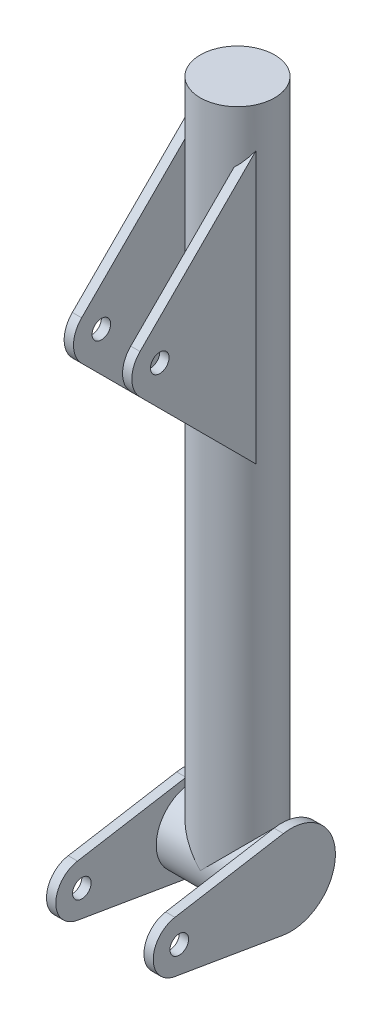
ISO-10303-21;
HEADER;
FILE_DESCRIPTION(('STEP AP214'),'2;1');
FILE_NAME('part.step','',(''),(''),'','','');
FILE_SCHEMA(('AUTOMOTIVE_DESIGN { 1 0 10303 214 1 1 1 1 }'));
ENDSEC;
DATA;
#1=APPLICATION_CONTEXT('core data for automotive mechanical design processes');
#2=APPLICATION_PROTOCOL_DEFINITION('international standard','automotive_design',2000,#1);
#3=PRODUCT_CONTEXT('',#1,'mechanical');
#4=PRODUCT('Part','Part','',(#3));
#5=PRODUCT_RELATED_PRODUCT_CATEGORY('part','',(#4));
#6=PRODUCT_DEFINITION_FORMATION('','',#4);
#7=PRODUCT_DEFINITION_CONTEXT('part definition',#1,'design');
#8=PRODUCT_DEFINITION('design','',#6,#7);
#9=PRODUCT_DEFINITION_SHAPE('','',#8);
#10=(LENGTH_UNIT() NAMED_UNIT(*) SI_UNIT(.MILLI.,.METRE.));
#11=(NAMED_UNIT(*) PLANE_ANGLE_UNIT() SI_UNIT($,.RADIAN.));
#12=(NAMED_UNIT(*) SI_UNIT($,.STERADIAN.) SOLID_ANGLE_UNIT());
#13=UNCERTAINTY_MEASURE_WITH_UNIT(LENGTH_MEASURE(1.E-05),#10,'distance_accuracy_value','');
#14=(GEOMETRIC_REPRESENTATION_CONTEXT(3) GLOBAL_UNCERTAINTY_ASSIGNED_CONTEXT((#13)) GLOBAL_UNIT_ASSIGNED_CONTEXT((#10,
#11,#12)) REPRESENTATION_CONTEXT('',''));
#15=CARTESIAN_POINT('',(0.,0.,0.));
#16=DIRECTION('',(0.,0.,1.));
#17=DIRECTION('',(1.,0.,0.));
#18=AXIS2_PLACEMENT_3D('',#15,#16,#17);
#19=CARTESIAN_POINT('',(0.,228.6,0.));
#20=DIRECTION('',(0.,-1.,0.));
#21=DIRECTION('',(0.,0.,-1.));
#22=AXIS2_PLACEMENT_3D('',#19,#20,#21);
#23=CYLINDRICAL_SURFACE('',#22,12.7);
#24=CARTESIAN_POINT('',(0.,0.,0.));
#25=DIRECTION('',(-0.707106781186547,0.707106781186548,0.));
#26=DIRECTION('',(-0.707106781186547,-0.707106781186548,0.));
#27=AXIS2_PLACEMENT_3D('',#24,#25,#26);
#28=ELLIPSE('',#27,17.9605122421383,12.7);
#29=CARTESIAN_POINT('',(0.,0.,12.7));
#30=VERTEX_POINT('',#29);
#31=CARTESIAN_POINT('',(0.,0.,-12.7));
#32=VERTEX_POINT('',#31);
#33=EDGE_CURVE('E328',#30,#32,#28,.T.);
#34=ORIENTED_EDGE('',*,*,#33,.T.);
#35=CARTESIAN_POINT('',(0.,0.,0.));
#36=DIRECTION('',(-0.707106781186547,-0.707106781186548,0.));
#37=DIRECTION('',(-0.707106781186547,0.707106781186548,0.));
#38=AXIS2_PLACEMENT_3D('',#35,#36,#37);
#39=ELLIPSE('',#38,17.9605122421383,12.7);
#40=EDGE_CURVE('E331',#32,#30,#39,.F.);
#41=ORIENTED_EDGE('',*,*,#40,.T.);
#42=EDGE_LOOP('',(#34,#41));
#43=FACE_BOUND('',#42,.T.);
#44=CARTESIAN_POINT('',(0.,228.6,0.));
#45=DIRECTION('',(0.,1.,0.));
#46=DIRECTION('',(0.,0.,1.));
#47=AXIS2_PLACEMENT_3D('',#44,#45,#46);
#48=CIRCLE('',#47,12.7);
#49=CARTESIAN_POINT('',(0.,228.6,12.7));
#50=VERTEX_POINT('',#49);
#51=EDGE_CURVE('E287',#50,#50,#48,.T.);
#52=ORIENTED_EDGE('',*,*,#51,.F.);
#53=EDGE_LOOP('',(#52));
#54=FACE_BOUND('',#53,.T.);
#55=CARTESIAN_POINT('',(0.,220.251784181604,0.));
#56=DIRECTION('',(0.,-0.707106781186548,-0.707106781186548));
#57=DIRECTION('',(0.,-0.707106781186548,0.707106781186548));
#58=AXIS2_PLACEMENT_3D('',#55,#56,#57);
#59=ELLIPSE('',#58,17.9605122421383,12.7);
#60=CARTESIAN_POINT('',(11.557,214.98625942143,5.26552476017346));
#61=VERTEX_POINT('',#60);
#62=CARTESIAN_POINT('',(8.382,210.710711076339,9.54107310526443));
#63=VERTEX_POINT('',#62);
#64=EDGE_CURVE('E337',#61,#63,#59,.T.);
#65=ORIENTED_EDGE('',*,*,#64,.F.);
#66=DIRECTION('',(0.,-1.,0.));
#67=VECTOR('',#66,1.);
#68=CARTESIAN_POINT('',(11.557,228.6,5.26552476017348));
#69=LINE('',#68,#67);
#70=CARTESIAN_POINT('',(11.557,122.37654057857,5.2655247601735));
#71=VERTEX_POINT('',#70);
#72=EDGE_CURVE('E12',#61,#71,#69,.T.);
#73=ORIENTED_EDGE('',*,*,#72,.T.);
#74=CARTESIAN_POINT('',(0.,117.111015818396,0.));
#75=DIRECTION('',(0.,0.707106781186548,-0.707106781186547));
#76=DIRECTION('',(0.,-0.707106781186547,-0.707106781186548));
#77=AXIS2_PLACEMENT_3D('',#74,#75,#76);
#78=ELLIPSE('',#77,17.9605122421383,12.7);
#79=CARTESIAN_POINT('',(8.382,126.652088923661,9.54107310526442));
#80=VERTEX_POINT('',#79);
#81=EDGE_CURVE('E68',#80,#71,#78,.T.);
#82=ORIENTED_EDGE('',*,*,#81,.F.);
#83=DIRECTION('',(0.,-1.,0.));
#84=VECTOR('',#83,1.);
#85=CARTESIAN_POINT('',(8.382,228.6,9.54107310526442));
#86=LINE('',#85,#84);
#87=EDGE_CURVE('E334',#63,#80,#86,.T.);
#88=ORIENTED_EDGE('',*,*,#87,.F.);
#89=EDGE_LOOP('',(#65,#73,#82,#88));
#90=FACE_BOUND('',#89,.T.);
#91=CARTESIAN_POINT('',(0.,117.111015818396,0.));
#92=DIRECTION('',(0.,-0.707106781186548,0.707106781186547));
#93=DIRECTION('',(0.,-0.707106781186547,-0.707106781186548));
#94=AXIS2_PLACEMENT_3D('',#91,#92,#93);
#95=ELLIPSE('',#94,17.9605122421383,12.7);
#96=CARTESIAN_POINT('',(-8.382,126.652088923661,9.54107310526442));
#97=VERTEX_POINT('',#96);
#98=CARTESIAN_POINT('',(-11.557,122.37654057857,5.26552476017348));
#99=VERTEX_POINT('',#98);
#100=EDGE_CURVE('E75',#97,#99,#95,.T.);
#101=ORIENTED_EDGE('',*,*,#100,.T.);
#102=DIRECTION('',(0.,-1.,0.));
#103=VECTOR('',#102,1.);
#104=CARTESIAN_POINT('',(-11.557,228.6,5.26552476017348));
#105=LINE('',#104,#103);
#106=CARTESIAN_POINT('',(-11.557,214.98625942143,5.26552476017346));
#107=VERTEX_POINT('',#106);
#108=EDGE_CURVE('E259',#107,#99,#105,.T.);
#109=ORIENTED_EDGE('',*,*,#108,.F.);
#110=CARTESIAN_POINT('',(0.,220.251784181604,0.));
#111=DIRECTION('',(0.,0.707106781186548,0.707106781186548));
#112=DIRECTION('',(0.,-0.707106781186548,0.707106781186548));
#113=AXIS2_PLACEMENT_3D('',#110,#111,#112);
#114=ELLIPSE('',#113,17.9605122421383,12.7);
#115=CARTESIAN_POINT('',(-8.382,210.710711076339,9.54107310526439));
#116=VERTEX_POINT('',#115);
#117=EDGE_CURVE('E195',#107,#116,#114,.T.);
#118=ORIENTED_EDGE('',*,*,#117,.T.);
#119=DIRECTION('',(0.,-1.,0.));
#120=VECTOR('',#119,1.);
#121=CARTESIAN_POINT('',(-8.382,228.6,9.54107310526442));
#122=LINE('',#121,#120);
#123=EDGE_CURVE('E80',#116,#97,#122,.T.);
#124=ORIENTED_EDGE('',*,*,#123,.T.);
#125=EDGE_LOOP('',(#101,#109,#118,#124));
#126=FACE_BOUND('',#125,.T.);
#127=ADVANCED_FACE('F60',(#43,#54,#90,#126),#23,.T.);
#128=CARTESIAN_POINT('',(15.0495,0.,0.));
#129=DIRECTION('',(-1.,0.,0.));
#130=DIRECTION('',(0.,0.,1.));
#131=AXIS2_PLACEMENT_3D('',#128,#129,#130);
#132=CYLINDRICAL_SURFACE('',#131,12.7);
#133=CARTESIAN_POINT('',(-15.0495,0.,0.));
#134=DIRECTION('',(1.,0.,0.));
#135=DIRECTION('',(0.,0.,-1.));
#136=AXIS2_PLACEMENT_3D('',#133,#134,#135);
#137=CIRCLE('',#136,12.7);
#138=CARTESIAN_POINT('',(-15.0495,0.,-12.7));
#139=VERTEX_POINT('',#138);
#140=EDGE_CURVE('E248',#139,#139,#137,.T.);
#141=ORIENTED_EDGE('',*,*,#140,.T.);
#142=EDGE_LOOP('',(#141));
#143=FACE_BOUND('',#142,.T.);
#144=CARTESIAN_POINT('',(15.0495,0.,0.));
#145=DIRECTION('',(1.,0.,0.));
#146=DIRECTION('',(0.,0.,-1.));
#147=AXIS2_PLACEMENT_3D('',#144,#145,#146);
#148=CIRCLE('',#147,12.7);
#149=CARTESIAN_POINT('',(15.0495,0.,-12.7));
#150=VERTEX_POINT('',#149);
#151=EDGE_CURVE('E318',#150,#150,#148,.T.);
#152=ORIENTED_EDGE('',*,*,#151,.F.);
#153=EDGE_LOOP('',(#152));
#154=FACE_BOUND('',#153,.T.);
#155=ORIENTED_EDGE('',*,*,#40,.F.);
#156=ORIENTED_EDGE('',*,*,#33,.F.);
#157=EDGE_LOOP('',(#155,#156));
#158=FACE_BOUND('',#157,.T.);
#159=ADVANCED_FACE('F62',(#143,#154,#158),#132,.T.);
#160=CARTESIAN_POINT('',(18.2245,0.,38.1));
#161=DIRECTION('',(1.,0.,0.));
#162=DIRECTION('',(0.,0.,-1.));
#163=AXIS2_PLACEMENT_3D('',#160,#161,#162);
#164=PLANE('',#163);
#165=DIRECTION('',(0.,0.166666666666667,0.986013297183269));
#166=VECTOR('',#165,1.);
#167=CARTESIAN_POINT('',(18.2245,-15.026842649073,2.54));
#168=LINE('',#167,#166);
#169=CARTESIAN_POINT('',(18.2245,-15.026842649073,2.54000000000001));
#170=VERTEX_POINT('',#169);
#171=CARTESIAN_POINT('',(18.2245,-8.76565821195926,39.5816666666667));
#172=VERTEX_POINT('',#171);
#173=EDGE_CURVE('E297',#170,#172,#168,.T.);
#174=ORIENTED_EDGE('',*,*,#173,.F.);
#175=CARTESIAN_POINT('',(18.2245,0.,0.));
#176=DIRECTION('',(1.,0.,0.));
#177=DIRECTION('',(0.,0.,-1.));
#178=AXIS2_PLACEMENT_3D('',#175,#176,#177);
#179=CIRCLE('',#178,15.24);
#180=CARTESIAN_POINT('',(18.2245,15.026842649073,2.53999999999999));
#181=VERTEX_POINT('',#180);
#182=EDGE_CURVE('E305',#170,#181,#179,.T.);
#183=ORIENTED_EDGE('',*,*,#182,.T.);
#184=DIRECTION('',(0.,-0.166666666666667,0.986013297183269));
#185=VECTOR('',#184,1.);
#186=CARTESIAN_POINT('',(18.2245,15.026842649073,2.54));
#187=LINE('',#186,#185);
#188=CARTESIAN_POINT('',(18.2245,8.76565821195926,39.5816666666667));
#189=VERTEX_POINT('',#188);
#190=EDGE_CURVE('E303',#181,#189,#187,.T.);
#191=ORIENTED_EDGE('',*,*,#190,.T.);
#192=CARTESIAN_POINT('',(18.2245,0.,38.1));
#193=DIRECTION('',(1.,0.,0.));
#194=DIRECTION('',(0.,0.,-1.));
#195=AXIS2_PLACEMENT_3D('',#192,#193,#194);
#196=CIRCLE('',#195,8.89);
#197=EDGE_CURVE('E300',#189,#172,#196,.T.);
#198=ORIENTED_EDGE('',*,*,#197,.T.);
#199=EDGE_LOOP('',(#174,#183,#191,#198));
#200=FACE_BOUND('',#199,.T.);
#201=CARTESIAN_POINT('',(18.2245,0.,38.1));
#202=DIRECTION('',(1.,0.,0.));
#203=DIRECTION('',(0.,0.,-1.));
#204=AXIS2_PLACEMENT_3D('',#201,#202,#203);
#205=CIRCLE('',#204,3.175);
#206=CARTESIAN_POINT('',(18.2245,0.,34.925));
#207=VERTEX_POINT('',#206);
#208=EDGE_CURVE('E291',#207,#207,#205,.T.);
#209=ORIENTED_EDGE('',*,*,#208,.F.);
#210=EDGE_LOOP('',(#209));
#211=FACE_BOUND('',#210,.T.);
#212=ADVANCED_FACE('F379',(#200,#211),#164,.T.);
#213=CARTESIAN_POINT('',(15.0495,0.,38.1));
#214=DIRECTION('',(1.,0.,0.));
#215=DIRECTION('',(0.,0.,-1.));
#216=AXIS2_PLACEMENT_3D('',#213,#214,#215);
#217=PLANE('',#216);
#218=ORIENTED_EDGE('',*,*,#151,.T.);
#219=EDGE_LOOP('',(#218));
#220=FACE_BOUND('',#219,.T.);
#221=DIRECTION('',(0.,0.166666666666667,0.986013297183269));
#222=VECTOR('',#221,1.);
#223=CARTESIAN_POINT('',(15.0495,-15.026842649073,2.54));
#224=LINE('',#223,#222);
#225=CARTESIAN_POINT('',(15.0495,-15.026842649073,2.54000000000001));
#226=VERTEX_POINT('',#225);
#227=CARTESIAN_POINT('',(15.0495,-8.76565821195926,39.5816666666667));
#228=VERTEX_POINT('',#227);
#229=EDGE_CURVE('E294',#226,#228,#224,.T.);
#230=ORIENTED_EDGE('',*,*,#229,.T.);
#231=CARTESIAN_POINT('',(15.0495,0.,38.1));
#232=DIRECTION('',(1.,0.,0.));
#233=DIRECTION('',(0.,0.,-1.));
#234=AXIS2_PLACEMENT_3D('',#231,#232,#233);
#235=CIRCLE('',#234,8.89);
#236=CARTESIAN_POINT('',(15.0495,8.76565821195926,39.5816666666667));
#237=VERTEX_POINT('',#236);
#238=EDGE_CURVE('E310',#237,#228,#235,.T.);
#239=ORIENTED_EDGE('',*,*,#238,.F.);
#240=DIRECTION('',(0.,-0.166666666666667,0.986013297183269));
#241=VECTOR('',#240,1.);
#242=CARTESIAN_POINT('',(15.0495,15.026842649073,2.54));
#243=LINE('',#242,#241);
#244=CARTESIAN_POINT('',(15.0495,15.026842649073,2.53999999999999));
#245=VERTEX_POINT('',#244);
#246=EDGE_CURVE('E313',#245,#237,#243,.T.);
#247=ORIENTED_EDGE('',*,*,#246,.F.);
#248=CARTESIAN_POINT('',(15.0495,0.,0.));
#249=DIRECTION('',(1.,0.,0.));
#250=DIRECTION('',(0.,0.,-1.));
#251=AXIS2_PLACEMENT_3D('',#248,#249,#250);
#252=CIRCLE('',#251,15.24);
#253=EDGE_CURVE('E301',#226,#245,#252,.T.);
#254=ORIENTED_EDGE('',*,*,#253,.F.);
#255=EDGE_LOOP('',(#230,#239,#247,#254));
#256=FACE_BOUND('',#255,.T.);
#257=CARTESIAN_POINT('',(15.0495,0.,38.1));
#258=DIRECTION('',(1.,0.,0.));
#259=DIRECTION('',(0.,0.,-1.));
#260=AXIS2_PLACEMENT_3D('',#257,#258,#259);
#261=CIRCLE('',#260,3.175);
#262=CARTESIAN_POINT('',(15.0495,0.,34.925));
#263=VERTEX_POINT('',#262);
#264=EDGE_CURVE('E290',#263,#263,#261,.T.);
#265=ORIENTED_EDGE('',*,*,#264,.T.);
#266=EDGE_LOOP('',(#265));
#267=FACE_BOUND('',#266,.T.);
#268=ADVANCED_FACE('F392',(#220,#256,#267),#217,.F.);
#269=CARTESIAN_POINT('',(18.2245,-15.026842649073,2.54));
#270=DIRECTION('',(0.,-0.986013297183269,0.166666666666667));
#271=DIRECTION('',(0.,-0.166666666666667,-0.986013297183269));
#272=AXIS2_PLACEMENT_3D('',#269,#270,#271);
#273=PLANE('',#272);
#274=ORIENTED_EDGE('',*,*,#229,.F.);
#275=DIRECTION('',(-1.,0.,0.));
#276=VECTOR('',#275,1.);
#277=CARTESIAN_POINT('',(18.2245,-15.026842649073,2.54000000000001));
#278=LINE('',#277,#276);
#279=EDGE_CURVE('E316',#170,#226,#278,.T.);
#280=ORIENTED_EDGE('',*,*,#279,.F.);
#281=ORIENTED_EDGE('',*,*,#173,.T.);
#282=DIRECTION('',(-1.,0.,0.));
#283=VECTOR('',#282,1.);
#284=CARTESIAN_POINT('',(18.2245,-8.76565821195926,39.5816666666667));
#285=LINE('',#284,#283);
#286=EDGE_CURVE('E307',#172,#228,#285,.T.);
#287=ORIENTED_EDGE('',*,*,#286,.T.);
#288=EDGE_LOOP('',(#274,#280,#281,#287));
#289=FACE_BOUND('',#288,.T.);
#290=ADVANCED_FACE('F396',(#289),#273,.T.);
#291=CARTESIAN_POINT('',(18.2245,0.,0.));
#292=DIRECTION('',(-1.,0.,0.));
#293=DIRECTION('',(0.,0.,1.));
#294=AXIS2_PLACEMENT_3D('',#291,#292,#293);
#295=CYLINDRICAL_SURFACE('',#294,15.24);
#296=ORIENTED_EDGE('',*,*,#253,.T.);
#297=DIRECTION('',(-1.,0.,0.));
#298=VECTOR('',#297,1.);
#299=CARTESIAN_POINT('',(18.2245,15.026842649073,2.53999999999999));
#300=LINE('',#299,#298);
#301=EDGE_CURVE('E319',#181,#245,#300,.T.);
#302=ORIENTED_EDGE('',*,*,#301,.F.);
#303=ORIENTED_EDGE('',*,*,#182,.F.);
#304=ORIENTED_EDGE('',*,*,#279,.T.);
#305=EDGE_LOOP('',(#296,#302,#303,#304));
#306=FACE_BOUND('',#305,.T.);
#307=ADVANCED_FACE('F398',(#306),#295,.T.);
#308=CARTESIAN_POINT('',(18.2245,15.026842649073,2.54));
#309=DIRECTION('',(0.,-0.986013297183269,-0.166666666666667));
#310=DIRECTION('',(0.,0.166666666666667,-0.986013297183269));
#311=AXIS2_PLACEMENT_3D('',#308,#309,#310);
#312=PLANE('',#311);
#313=ORIENTED_EDGE('',*,*,#246,.T.);
#314=DIRECTION('',(-1.,0.,0.));
#315=VECTOR('',#314,1.);
#316=CARTESIAN_POINT('',(18.2245,8.76565821195926,39.5816666666667));
#317=LINE('',#316,#315);
#318=EDGE_CURVE('E322',#189,#237,#317,.T.);
#319=ORIENTED_EDGE('',*,*,#318,.F.);
#320=ORIENTED_EDGE('',*,*,#190,.F.);
#321=ORIENTED_EDGE('',*,*,#301,.T.);
#322=EDGE_LOOP('',(#313,#319,#320,#321));
#323=FACE_BOUND('',#322,.T.);
#324=ADVANCED_FACE('F401',(#323),#312,.F.);
#325=CARTESIAN_POINT('',(18.2245,0.,38.1));
#326=DIRECTION('',(-1.,0.,0.));
#327=DIRECTION('',(0.,0.,1.));
#328=AXIS2_PLACEMENT_3D('',#325,#326,#327);
#329=CYLINDRICAL_SURFACE('',#328,8.89);
#330=ORIENTED_EDGE('',*,*,#238,.T.);
#331=ORIENTED_EDGE('',*,*,#286,.F.);
#332=ORIENTED_EDGE('',*,*,#197,.F.);
#333=ORIENTED_EDGE('',*,*,#318,.T.);
#334=EDGE_LOOP('',(#330,#331,#332,#333));
#335=FACE_BOUND('',#334,.T.);
#336=ADVANCED_FACE('F388',(#335),#329,.T.);
#337=CARTESIAN_POINT('',(18.2245,0.,38.1));
#338=DIRECTION('',(-1.,0.,0.));
#339=DIRECTION('',(0.,0.,1.));
#340=AXIS2_PLACEMENT_3D('',#337,#338,#339);
#341=CYLINDRICAL_SURFACE('',#340,3.175);
#342=ORIENTED_EDGE('',*,*,#208,.T.);
#343=EDGE_LOOP('',(#342));
#344=FACE_BOUND('',#343,.T.);
#345=ORIENTED_EDGE('',*,*,#264,.F.);
#346=EDGE_LOOP('',(#345));
#347=FACE_BOUND('',#346,.T.);
#348=ADVANCED_FACE('F385',(#344,#347),#341,.F.);
#349=CARTESIAN_POINT('',(0.,228.6,0.));
#350=DIRECTION('',(0.,1.,0.));
#351=DIRECTION('',(0.,0.,1.));
#352=AXIS2_PLACEMENT_3D('',#349,#350,#351);
#353=PLANE('',#352);
#354=ORIENTED_EDGE('',*,*,#51,.T.);
#355=EDGE_LOOP('',(#354));
#356=FACE_BOUND('',#355,.T.);
#357=ADVANCED_FACE('F384',(#356),#353,.T.);
#358=CARTESIAN_POINT('',(11.557,0.,0.));
#359=DIRECTION('',(1.,0.,0.));
#360=DIRECTION('',(0.,0.,-1.));
#361=AXIS2_PLACEMENT_3D('',#358,#359,#360);
#362=PLANE('',#361);
#363=CARTESIAN_POINT('',(11.557,168.6814,38.1));
#364=DIRECTION('',(1.,0.,0.));
#365=DIRECTION('',(0.,0.,-1.));
#366=AXIS2_PLACEMENT_3D('',#363,#364,#365);
#367=CIRCLE('',#366,3.175);
#368=CARTESIAN_POINT('',(11.557,168.6814,34.925));
#369=VERTEX_POINT('',#368);
#370=EDGE_CURVE('E270',#369,#369,#367,.T.);
#371=ORIENTED_EDGE('',*,*,#370,.F.);
#372=EDGE_LOOP('',(#371));
#373=FACE_BOUND('',#372,.T.);
#374=ORIENTED_EDGE('',*,*,#72,.F.);
#375=DIRECTION('',(0.,-0.707106781186548,0.707106781186548));
#376=VECTOR('',#375,1.);
#377=CARTESIAN_POINT('',(11.557,110.125892090802,110.125892090802));
#378=LINE('',#377,#376);
#379=CARTESIAN_POINT('',(11.557,175.416592090802,44.8351920908019));
#380=VERTEX_POINT('',#379);
#381=EDGE_CURVE('E265',#61,#380,#378,.T.);
#382=ORIENTED_EDGE('',*,*,#381,.T.);
#383=CARTESIAN_POINT('',(11.557,168.6814,38.1));
#384=DIRECTION('',(1.,0.,0.));
#385=DIRECTION('',(0.,0.,-1.));
#386=AXIS2_PLACEMENT_3D('',#383,#384,#385);
#387=CIRCLE('',#386,9.525);
#388=CARTESIAN_POINT('',(11.557,161.946207909198,44.8351920908018));
#389=VERTEX_POINT('',#388);
#390=EDGE_CURVE('E268',#380,#389,#387,.T.);
#391=ORIENTED_EDGE('',*,*,#390,.T.);
#392=DIRECTION('',(0.,-0.707106781186547,-0.707106781186548));
#393=VECTOR('',#392,1.);
#394=CARTESIAN_POINT('',(11.557,58.5555079091982,-58.5555079091982));
#395=LINE('',#394,#393);
#396=EDGE_CURVE('E262',#389,#71,#395,.T.);
#397=ORIENTED_EDGE('',*,*,#396,.T.);
#398=EDGE_LOOP('',(#374,#382,#391,#397));
#399=FACE_BOUND('',#398,.T.);
#400=ADVANCED_FACE('F347',(#373,#399),#362,.T.);
#401=CARTESIAN_POINT('',(8.382,0.,0.));
#402=DIRECTION('',(1.,0.,0.));
#403=DIRECTION('',(0.,0.,-1.));
#404=AXIS2_PLACEMENT_3D('',#401,#402,#403);
#405=PLANE('',#404);
#406=CARTESIAN_POINT('',(8.382,168.6814,38.1));
#407=DIRECTION('',(1.,0.,0.));
#408=DIRECTION('',(0.,0.,-1.));
#409=AXIS2_PLACEMENT_3D('',#406,#407,#408);
#410=CIRCLE('',#409,3.175);
#411=CARTESIAN_POINT('',(8.382,168.6814,34.925));
#412=VERTEX_POINT('',#411);
#413=EDGE_CURVE('E266',#412,#412,#410,.T.);
#414=ORIENTED_EDGE('',*,*,#413,.T.);
#415=EDGE_LOOP('',(#414));
#416=FACE_BOUND('',#415,.T.);
#417=DIRECTION('',(0.,-0.707106781186548,0.707106781186548));
#418=VECTOR('',#417,1.);
#419=CARTESIAN_POINT('',(8.382,110.125892090802,110.125892090802));
#420=LINE('',#419,#418);
#421=CARTESIAN_POINT('',(8.382,175.416592090802,44.8351920908019));
#422=VERTEX_POINT('',#421);
#423=EDGE_CURVE('E276',#63,#422,#420,.T.);
#424=ORIENTED_EDGE('',*,*,#423,.F.);
#425=ORIENTED_EDGE('',*,*,#87,.T.);
#426=DIRECTION('',(0.,-0.707106781186547,-0.707106781186548));
#427=VECTOR('',#426,1.);
#428=CARTESIAN_POINT('',(8.382,58.5555079091982,-58.5555079091982));
#429=LINE('',#428,#427);
#430=CARTESIAN_POINT('',(8.382,161.946207909198,44.8351920908018));
#431=VERTEX_POINT('',#430);
#432=EDGE_CURVE('E261',#431,#80,#429,.T.);
#433=ORIENTED_EDGE('',*,*,#432,.F.);
#434=CARTESIAN_POINT('',(8.382,168.6814,38.1));
#435=DIRECTION('',(1.,0.,0.));
#436=DIRECTION('',(0.,0.,-1.));
#437=AXIS2_PLACEMENT_3D('',#434,#435,#436);
#438=CIRCLE('',#437,9.525);
#439=EDGE_CURVE('E278',#422,#431,#438,.T.);
#440=ORIENTED_EDGE('',*,*,#439,.F.);
#441=EDGE_LOOP('',(#424,#425,#433,#440));
#442=FACE_BOUND('',#441,.T.);
#443=ADVANCED_FACE('F357',(#416,#442),#405,.F.);
#444=CARTESIAN_POINT('',(11.557,58.5555079091982,-58.5555079091982));
#445=DIRECTION('',(0.,0.707106781186548,-0.707106781186547));
#446=DIRECTION('',(0.,0.707106781186547,0.707106781186548));
#447=AXIS2_PLACEMENT_3D('',#444,#445,#446);
#448=PLANE('',#447);
#449=ORIENTED_EDGE('',*,*,#432,.T.);
#450=ORIENTED_EDGE('',*,*,#81,.T.);
#451=ORIENTED_EDGE('',*,*,#396,.F.);
#452=DIRECTION('',(-1.,0.,0.));
#453=VECTOR('',#452,1.);
#454=CARTESIAN_POINT('',(11.557,161.946207909198,44.8351920908018));
#455=LINE('',#454,#453);
#456=EDGE_CURVE('E273',#389,#431,#455,.T.);
#457=ORIENTED_EDGE('',*,*,#456,.T.);
#458=EDGE_LOOP('',(#449,#450,#451,#457));
#459=FACE_BOUND('',#458,.T.);
#460=ADVANCED_FACE('F342',(#459),#448,.F.);
#461=CARTESIAN_POINT('',(11.557,110.125892090802,110.125892090802));
#462=DIRECTION('',(0.,-0.707106781186548,-0.707106781186548));
#463=DIRECTION('',(0.,0.707106781186548,-0.707106781186548));
#464=AXIS2_PLACEMENT_3D('',#461,#462,#463);
#465=PLANE('',#464);
#466=ORIENTED_EDGE('',*,*,#381,.F.);
#467=ORIENTED_EDGE('',*,*,#64,.T.);
#468=ORIENTED_EDGE('',*,*,#423,.T.);
#469=DIRECTION('',(-1.,0.,0.));
#470=VECTOR('',#469,1.);
#471=CARTESIAN_POINT('',(11.557,175.416592090802,44.8351920908019));
#472=LINE('',#471,#470);
#473=EDGE_CURVE('E284',#380,#422,#472,.T.);
#474=ORIENTED_EDGE('',*,*,#473,.F.);
#475=EDGE_LOOP('',(#466,#467,#468,#474));
#476=FACE_BOUND('',#475,.T.);
#477=ADVANCED_FACE('F359',(#476),#465,.F.);
#478=CARTESIAN_POINT('',(11.557,168.6814,38.1));
#479=DIRECTION('',(-1.,0.,0.));
#480=DIRECTION('',(0.,0.,1.));
#481=AXIS2_PLACEMENT_3D('',#478,#479,#480);
#482=CYLINDRICAL_SURFACE('',#481,9.525);
#483=ORIENTED_EDGE('',*,*,#439,.T.);
#484=ORIENTED_EDGE('',*,*,#456,.F.);
#485=ORIENTED_EDGE('',*,*,#390,.F.);
#486=ORIENTED_EDGE('',*,*,#473,.T.);
#487=EDGE_LOOP('',(#483,#484,#485,#486));
#488=FACE_BOUND('',#487,.T.);
#489=ADVANCED_FACE('F353',(#488),#482,.T.);
#490=CARTESIAN_POINT('',(11.557,168.6814,38.1));
#491=DIRECTION('',(-1.,0.,0.));
#492=DIRECTION('',(0.,0.,1.));
#493=AXIS2_PLACEMENT_3D('',#490,#491,#492);
#494=CYLINDRICAL_SURFACE('',#493,3.175);
#495=ORIENTED_EDGE('',*,*,#370,.T.);
#496=EDGE_LOOP('',(#495));
#497=FACE_BOUND('',#496,.T.);
#498=ORIENTED_EDGE('',*,*,#413,.F.);
#499=EDGE_LOOP('',(#498));
#500=FACE_BOUND('',#499,.T.);
#501=ADVANCED_FACE('F367',(#497,#500),#494,.F.);
#502=CARTESIAN_POINT('',(-11.557,168.6814,38.1));
#503=DIRECTION('',(1.,0.,0.));
#504=DIRECTION('',(0.,0.,1.));
#505=AXIS2_PLACEMENT_3D('',#502,#503,#504);
#506=CYLINDRICAL_SURFACE('',#505,3.175);
#507=CARTESIAN_POINT('',(-11.557,168.6814,38.1));
#508=DIRECTION('',(1.,0.,0.));
#509=DIRECTION('',(0.,0.,-1.));
#510=AXIS2_PLACEMENT_3D('',#507,#508,#509);
#511=CIRCLE('',#510,3.175);
#512=CARTESIAN_POINT('',(-11.557,168.6814,34.925));
#513=VERTEX_POINT('',#512);
#514=EDGE_CURVE('E201',#513,#513,#511,.T.);
#515=ORIENTED_EDGE('',*,*,#514,.F.);
#516=EDGE_LOOP('',(#515));
#517=FACE_BOUND('',#516,.T.);
#518=CARTESIAN_POINT('',(-8.382,168.6814,38.1));
#519=DIRECTION('',(1.,0.,0.));
#520=DIRECTION('',(0.,0.,-1.));
#521=AXIS2_PLACEMENT_3D('',#518,#519,#520);
#522=CIRCLE('',#521,3.175);
#523=CARTESIAN_POINT('',(-8.382,168.6814,34.925));
#524=VERTEX_POINT('',#523);
#525=EDGE_CURVE('E212',#524,#524,#522,.T.);
#526=ORIENTED_EDGE('',*,*,#525,.T.);
#527=EDGE_LOOP('',(#526));
#528=FACE_BOUND('',#527,.T.);
#529=ADVANCED_FACE('F446',(#517,#528),#506,.F.);
#530=CARTESIAN_POINT('',(-11.557,168.6814,38.1));
#531=DIRECTION('',(1.,0.,0.));
#532=DIRECTION('',(0.,0.,1.));
#533=AXIS2_PLACEMENT_3D('',#530,#531,#532);
#534=CYLINDRICAL_SURFACE('',#533,9.525);
#535=CARTESIAN_POINT('',(-8.382,168.6814,38.1));
#536=DIRECTION('',(1.,0.,0.));
#537=DIRECTION('',(0.,0.,-1.));
#538=AXIS2_PLACEMENT_3D('',#535,#536,#537);
#539=CIRCLE('',#538,9.525);
#540=CARTESIAN_POINT('',(-8.382,175.416592090802,44.8351920908019));
#541=VERTEX_POINT('',#540);
#542=CARTESIAN_POINT('',(-8.382,161.946207909198,44.8351920908018));
#543=VERTEX_POINT('',#542);
#544=EDGE_CURVE('E184',#541,#543,#539,.T.);
#545=ORIENTED_EDGE('',*,*,#544,.F.);
#546=DIRECTION('',(1.,0.,0.));
#547=VECTOR('',#546,1.);
#548=CARTESIAN_POINT('',(-11.557,175.416592090802,44.8351920908019));
#549=LINE('',#548,#547);
#550=CARTESIAN_POINT('',(-11.557,175.416592090802,44.8351920908019));
#551=VERTEX_POINT('',#550);
#552=EDGE_CURVE('E177',#551,#541,#549,.T.);
#553=ORIENTED_EDGE('',*,*,#552,.F.);
#554=CARTESIAN_POINT('',(-11.557,168.6814,38.1));
#555=DIRECTION('',(1.,0.,0.));
#556=DIRECTION('',(0.,0.,-1.));
#557=AXIS2_PLACEMENT_3D('',#554,#555,#556);
#558=CIRCLE('',#557,9.525);
#559=CARTESIAN_POINT('',(-11.557,161.946207909198,44.8351920908018));
#560=VERTEX_POINT('',#559);
#561=EDGE_CURVE('E181',#551,#560,#558,.T.);
#562=ORIENTED_EDGE('',*,*,#561,.T.);
#563=DIRECTION('',(1.,0.,0.));
#564=VECTOR('',#563,1.);
#565=CARTESIAN_POINT('',(-11.557,161.946207909198,44.8351920908018));
#566=LINE('',#565,#564);
#567=EDGE_CURVE('E189',#560,#543,#566,.T.);
#568=ORIENTED_EDGE('',*,*,#567,.T.);
#569=EDGE_LOOP('',(#545,#553,#562,#568));
#570=FACE_BOUND('',#569,.T.);
#571=ADVANCED_FACE('F179',(#570),#534,.T.);
#572=CARTESIAN_POINT('',(-11.557,58.5555079091982,-58.5555079091982));
#573=DIRECTION('',(0.,0.707106781186548,-0.707106781186547));
#574=DIRECTION('',(0.,0.707106781186547,0.707106781186548));
#575=AXIS2_PLACEMENT_3D('',#572,#573,#574);
#576=PLANE('',#575);
#577=DIRECTION('',(0.,-0.707106781186547,-0.707106781186548));
#578=VECTOR('',#577,1.);
#579=CARTESIAN_POINT('',(-8.382,58.5555079091982,-58.5555079091982));
#580=LINE('',#579,#578);
#581=EDGE_CURVE('E207',#543,#97,#580,.T.);
#582=ORIENTED_EDGE('',*,*,#581,.F.);
#583=ORIENTED_EDGE('',*,*,#567,.F.);
#584=DIRECTION('',(0.,-0.707106781186547,-0.707106781186548));
#585=VECTOR('',#584,1.);
#586=CARTESIAN_POINT('',(-11.557,58.5555079091982,-58.5555079091982));
#587=LINE('',#586,#585);
#588=EDGE_CURVE('E198',#560,#99,#587,.T.);
#589=ORIENTED_EDGE('',*,*,#588,.T.);
#590=ORIENTED_EDGE('',*,*,#100,.F.);
#591=EDGE_LOOP('',(#582,#583,#589,#590));
#592=FACE_BOUND('',#591,.T.);
#593=ADVANCED_FACE('F538',(#592),#576,.F.);
#594=CARTESIAN_POINT('',(-11.557,110.125892090802,110.125892090802));
#595=DIRECTION('',(0.,-0.707106781186548,-0.707106781186548));
#596=DIRECTION('',(0.,0.707106781186548,-0.707106781186548));
#597=AXIS2_PLACEMENT_3D('',#594,#595,#596);
#598=PLANE('',#597);
#599=DIRECTION('',(0.,-0.707106781186548,0.707106781186548));
#600=VECTOR('',#599,1.);
#601=CARTESIAN_POINT('',(-11.557,110.125892090802,110.125892090802));
#602=LINE('',#601,#600);
#603=EDGE_CURVE('E193',#107,#551,#602,.T.);
#604=ORIENTED_EDGE('',*,*,#603,.T.);
#605=ORIENTED_EDGE('',*,*,#552,.T.);
#606=DIRECTION('',(0.,-0.707106781186548,0.707106781186548));
#607=VECTOR('',#606,1.);
#608=CARTESIAN_POINT('',(-8.382,110.125892090802,110.125892090802));
#609=LINE('',#608,#607);
#610=EDGE_CURVE('E209',#116,#541,#609,.T.);
#611=ORIENTED_EDGE('',*,*,#610,.F.);
#612=ORIENTED_EDGE('',*,*,#117,.F.);
#613=EDGE_LOOP('',(#604,#605,#611,#612));
#614=FACE_BOUND('',#613,.T.);
#615=ADVANCED_FACE('F194',(#614),#598,.F.);
#616=CARTESIAN_POINT('',(-8.382,0.,0.));
#617=DIRECTION('',(-1.,0.,0.));
#618=DIRECTION('',(0.,0.,-1.));
#619=AXIS2_PLACEMENT_3D('',#616,#617,#618);
#620=PLANE('',#619);
#621=ORIENTED_EDGE('',*,*,#525,.F.);
#622=EDGE_LOOP('',(#621));
#623=FACE_BOUND('',#622,.T.);
#624=ORIENTED_EDGE('',*,*,#610,.T.);
#625=ORIENTED_EDGE('',*,*,#544,.T.);
#626=ORIENTED_EDGE('',*,*,#581,.T.);
#627=ORIENTED_EDGE('',*,*,#123,.F.);
#628=EDGE_LOOP('',(#624,#625,#626,#627));
#629=FACE_BOUND('',#628,.T.);
#630=ADVANCED_FACE('F524',(#623,#629),#620,.F.);
#631=CARTESIAN_POINT('',(-11.557,0.,0.));
#632=DIRECTION('',(-1.,0.,0.));
#633=DIRECTION('',(0.,0.,-1.));
#634=AXIS2_PLACEMENT_3D('',#631,#632,#633);
#635=PLANE('',#634);
#636=ORIENTED_EDGE('',*,*,#514,.T.);
#637=EDGE_LOOP('',(#636));
#638=FACE_BOUND('',#637,.T.);
#639=ORIENTED_EDGE('',*,*,#108,.T.);
#640=ORIENTED_EDGE('',*,*,#588,.F.);
#641=ORIENTED_EDGE('',*,*,#561,.F.);
#642=ORIENTED_EDGE('',*,*,#603,.F.);
#643=EDGE_LOOP('',(#639,#640,#641,#642));
#644=FACE_BOUND('',#643,.T.);
#645=ADVANCED_FACE('F200',(#638,#644),#635,.T.);
#646=CARTESIAN_POINT('',(-18.2245,0.,38.1));
#647=DIRECTION('',(-1.,0.,0.));
#648=DIRECTION('',(0.,0.,-1.));
#649=AXIS2_PLACEMENT_3D('',#646,#647,#648);
#650=PLANE('',#649);
#651=DIRECTION('',(0.,0.166666666666667,0.986013297183269));
#652=VECTOR('',#651,1.);
#653=CARTESIAN_POINT('',(-18.2245,-15.026842649073,2.54));
#654=LINE('',#653,#652);
#655=CARTESIAN_POINT('',(-18.2245,-15.026842649073,2.54000000000001));
#656=VERTEX_POINT('',#655);
#657=CARTESIAN_POINT('',(-18.2245,-8.76565821195926,39.5816666666667));
#658=VERTEX_POINT('',#657);
#659=EDGE_CURVE('E222',#656,#658,#654,.T.);
#660=ORIENTED_EDGE('',*,*,#659,.T.);
#661=CARTESIAN_POINT('',(-18.2245,0.,38.1));
#662=DIRECTION('',(1.,0.,0.));
#663=DIRECTION('',(0.,0.,-1.));
#664=AXIS2_PLACEMENT_3D('',#661,#662,#663);
#665=CIRCLE('',#664,8.89);
#666=CARTESIAN_POINT('',(-18.2245,8.76565821195926,39.5816666666667));
#667=VERTEX_POINT('',#666);
#668=EDGE_CURVE('E225',#667,#658,#665,.T.);
#669=ORIENTED_EDGE('',*,*,#668,.F.);
#670=DIRECTION('',(0.,-0.166666666666667,0.986013297183269));
#671=VECTOR('',#670,1.);
#672=CARTESIAN_POINT('',(-18.2245,15.026842649073,2.54));
#673=LINE('',#672,#671);
#674=CARTESIAN_POINT('',(-18.2245,15.026842649073,2.53999999999999));
#675=VERTEX_POINT('',#674);
#676=EDGE_CURVE('E229',#675,#667,#673,.T.);
#677=ORIENTED_EDGE('',*,*,#676,.F.);
#678=CARTESIAN_POINT('',(-18.2245,0.,0.));
#679=DIRECTION('',(1.,0.,0.));
#680=DIRECTION('',(0.,0.,-1.));
#681=AXIS2_PLACEMENT_3D('',#678,#679,#680);
#682=CIRCLE('',#681,15.24);
#683=EDGE_CURVE('E232',#656,#675,#682,.T.);
#684=ORIENTED_EDGE('',*,*,#683,.F.);
#685=EDGE_LOOP('',(#660,#669,#677,#684));
#686=FACE_BOUND('',#685,.T.);
#687=CARTESIAN_POINT('',(-18.2245,0.,38.1));
#688=DIRECTION('',(1.,0.,0.));
#689=DIRECTION('',(0.,0.,-1.));
#690=AXIS2_PLACEMENT_3D('',#687,#688,#689);
#691=CIRCLE('',#690,3.175);
#692=CARTESIAN_POINT('',(-18.2245,0.,34.925));
#693=VERTEX_POINT('',#692);
#694=EDGE_CURVE('E216',#693,#693,#691,.T.);
#695=ORIENTED_EDGE('',*,*,#694,.T.);
#696=EDGE_LOOP('',(#695));
#697=FACE_BOUND('',#696,.T.);
#698=ADVANCED_FACE('F457',(#686,#697),#650,.T.);
#699=CARTESIAN_POINT('',(-15.0495,0.,38.1));
#700=DIRECTION('',(-1.,0.,0.));
#701=DIRECTION('',(0.,0.,-1.));
#702=AXIS2_PLACEMENT_3D('',#699,#700,#701);
#703=PLANE('',#702);
#704=ORIENTED_EDGE('',*,*,#140,.F.);
#705=EDGE_LOOP('',(#704));
#706=FACE_BOUND('',#705,.T.);
#707=DIRECTION('',(0.,0.166666666666667,0.986013297183269));
#708=VECTOR('',#707,1.);
#709=CARTESIAN_POINT('',(-15.0495,-15.026842649073,2.54));
#710=LINE('',#709,#708);
#711=CARTESIAN_POINT('',(-15.0495,-15.026842649073,2.54000000000001));
#712=VERTEX_POINT('',#711);
#713=CARTESIAN_POINT('',(-15.0495,-8.76565821195926,39.5816666666667));
#714=VERTEX_POINT('',#713);
#715=EDGE_CURVE('E219',#712,#714,#710,.T.);
#716=ORIENTED_EDGE('',*,*,#715,.F.);
#717=CARTESIAN_POINT('',(-15.0495,0.,0.));
#718=DIRECTION('',(1.,0.,0.));
#719=DIRECTION('',(0.,0.,-1.));
#720=AXIS2_PLACEMENT_3D('',#717,#718,#719);
#721=CIRCLE('',#720,15.24);
#722=CARTESIAN_POINT('',(-15.0495,15.026842649073,2.53999999999999));
#723=VERTEX_POINT('',#722);
#724=EDGE_CURVE('E226',#712,#723,#721,.T.);
#725=ORIENTED_EDGE('',*,*,#724,.T.);
#726=DIRECTION('',(0.,-0.166666666666667,0.986013297183269));
#727=VECTOR('',#726,1.);
#728=CARTESIAN_POINT('',(-15.0495,15.026842649073,2.54));
#729=LINE('',#728,#727);
#730=CARTESIAN_POINT('',(-15.0495,8.76565821195926,39.5816666666667));
#731=VERTEX_POINT('',#730);
#732=EDGE_CURVE('E241',#723,#731,#729,.T.);
#733=ORIENTED_EDGE('',*,*,#732,.T.);
#734=CARTESIAN_POINT('',(-15.0495,0.,38.1));
#735=DIRECTION('',(1.,0.,0.));
#736=DIRECTION('',(0.,0.,-1.));
#737=AXIS2_PLACEMENT_3D('',#734,#735,#736);
#738=CIRCLE('',#737,8.89);
#739=EDGE_CURVE('E238',#731,#714,#738,.T.);
#740=ORIENTED_EDGE('',*,*,#739,.T.);
#741=EDGE_LOOP('',(#716,#725,#733,#740));
#742=FACE_BOUND('',#741,.T.);
#743=CARTESIAN_POINT('',(-15.0495,0.,38.1));
#744=DIRECTION('',(1.,0.,0.));
#745=DIRECTION('',(0.,0.,-1.));
#746=AXIS2_PLACEMENT_3D('',#743,#744,#745);
#747=CIRCLE('',#746,3.175);
#748=CARTESIAN_POINT('',(-15.0495,0.,34.925));
#749=VERTEX_POINT('',#748);
#750=EDGE_CURVE('E188',#749,#749,#747,.T.);
#751=ORIENTED_EDGE('',*,*,#750,.F.);
#752=EDGE_LOOP('',(#751));
#753=FACE_BOUND('',#752,.T.);
#754=ADVANCED_FACE('F462',(#706,#742,#753),#703,.F.);
#755=CARTESIAN_POINT('',(-18.2245,-15.026842649073,2.54));
#756=DIRECTION('',(0.,-0.986013297183269,0.166666666666667));
#757=DIRECTION('',(0.,-0.166666666666667,-0.986013297183269));
#758=AXIS2_PLACEMENT_3D('',#755,#756,#757);
#759=PLANE('',#758);
#760=ORIENTED_EDGE('',*,*,#715,.T.);
#761=DIRECTION('',(1.,0.,0.));
#762=VECTOR('',#761,1.);
#763=CARTESIAN_POINT('',(-18.2245,-8.76565821195926,39.5816666666667));
#764=LINE('',#763,#762);
#765=EDGE_CURVE('E235',#658,#714,#764,.T.);
#766=ORIENTED_EDGE('',*,*,#765,.F.);
#767=ORIENTED_EDGE('',*,*,#659,.F.);
#768=DIRECTION('',(1.,0.,0.));
#769=VECTOR('',#768,1.);
#770=CARTESIAN_POINT('',(-18.2245,-15.026842649073,2.54000000000001));
#771=LINE('',#770,#769);
#772=EDGE_CURVE('E246',#656,#712,#771,.T.);
#773=ORIENTED_EDGE('',*,*,#772,.T.);
#774=EDGE_LOOP('',(#760,#766,#767,#773));
#775=FACE_BOUND('',#774,.T.);
#776=ADVANCED_FACE('F472',(#775),#759,.T.);
#777=CARTESIAN_POINT('',(-18.2245,0.,0.));
#778=DIRECTION('',(1.,0.,0.));
#779=DIRECTION('',(0.,0.,1.));
#780=AXIS2_PLACEMENT_3D('',#777,#778,#779);
#781=CYLINDRICAL_SURFACE('',#780,15.24);
#782=ORIENTED_EDGE('',*,*,#724,.F.);
#783=ORIENTED_EDGE('',*,*,#772,.F.);
#784=ORIENTED_EDGE('',*,*,#683,.T.);
#785=DIRECTION('',(1.,0.,0.));
#786=VECTOR('',#785,1.);
#787=CARTESIAN_POINT('',(-18.2245,15.026842649073,2.53999999999999));
#788=LINE('',#787,#786);
#789=EDGE_CURVE('E249',#675,#723,#788,.T.);
#790=ORIENTED_EDGE('',*,*,#789,.T.);
#791=EDGE_LOOP('',(#782,#783,#784,#790));
#792=FACE_BOUND('',#791,.T.);
#793=ADVANCED_FACE('F481',(#792),#781,.T.);
#794=CARTESIAN_POINT('',(-18.2245,15.026842649073,2.54));
#795=DIRECTION('',(0.,-0.986013297183269,-0.166666666666667));
#796=DIRECTION('',(0.,0.166666666666667,-0.986013297183269));
#797=AXIS2_PLACEMENT_3D('',#794,#795,#796);
#798=PLANE('',#797);
#799=ORIENTED_EDGE('',*,*,#732,.F.);
#800=ORIENTED_EDGE('',*,*,#789,.F.);
#801=ORIENTED_EDGE('',*,*,#676,.T.);
#802=DIRECTION('',(1.,0.,0.));
#803=VECTOR('',#802,1.);
#804=CARTESIAN_POINT('',(-18.2245,8.76565821195926,39.5816666666667));
#805=LINE('',#804,#803);
#806=EDGE_CURVE('E251',#667,#731,#805,.T.);
#807=ORIENTED_EDGE('',*,*,#806,.T.);
#808=EDGE_LOOP('',(#799,#800,#801,#807));
#809=FACE_BOUND('',#808,.T.);
#810=ADVANCED_FACE('F490',(#809),#798,.F.);
#811=CARTESIAN_POINT('',(-18.2245,0.,38.1));
#812=DIRECTION('',(1.,0.,0.));
#813=DIRECTION('',(0.,0.,1.));
#814=AXIS2_PLACEMENT_3D('',#811,#812,#813);
#815=CYLINDRICAL_SURFACE('',#814,8.89);
#816=ORIENTED_EDGE('',*,*,#739,.F.);
#817=ORIENTED_EDGE('',*,*,#806,.F.);
#818=ORIENTED_EDGE('',*,*,#668,.T.);
#819=ORIENTED_EDGE('',*,*,#765,.T.);
#820=EDGE_LOOP('',(#816,#817,#818,#819));
#821=FACE_BOUND('',#820,.T.);
#822=ADVANCED_FACE('F499',(#821),#815,.T.);
#823=CARTESIAN_POINT('',(-18.2245,0.,38.1));
#824=DIRECTION('',(1.,0.,0.));
#825=DIRECTION('',(0.,0.,1.));
#826=AXIS2_PLACEMENT_3D('',#823,#824,#825);
#827=CYLINDRICAL_SURFACE('',#826,3.175);
#828=ORIENTED_EDGE('',*,*,#694,.F.);
#829=EDGE_LOOP('',(#828));
#830=FACE_BOUND('',#829,.T.);
#831=ORIENTED_EDGE('',*,*,#750,.T.);
#832=EDGE_LOOP('',(#831));
#833=FACE_BOUND('',#832,.T.);
#834=ADVANCED_FACE('F508',(#830,#833),#827,.F.);
#835=CLOSED_SHELL('',(#127,#159,#212,#268,#290,#307,#324,#336,#348,#357,#400,#443,#460,#477,
#489,#501,#529,#571,#593,#615,#630,#645,#698,#754,#776,#793,#810,#822,#834));
#836=MANIFOLD_SOLID_BREP('B2',#835);
#837=ADVANCED_BREP_SHAPE_REPRESENTATION('',(#18,#836),#14);
#838=SHAPE_DEFINITION_REPRESENTATION(#9,#837);
ENDSEC;
END-ISO-10303-21;
